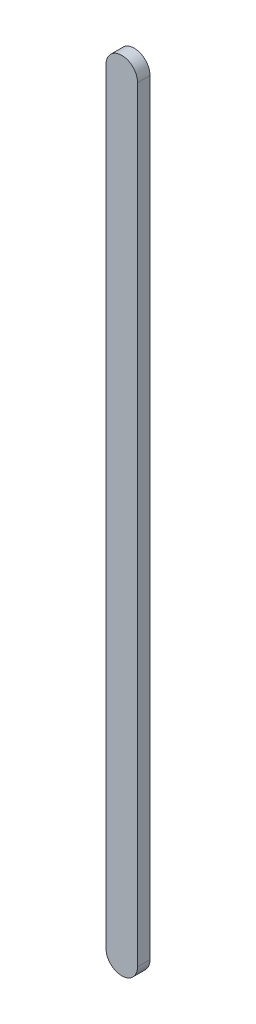
ISO-10303-21;
HEADER;
FILE_DESCRIPTION(('STEP AP214'),'2;1');
FILE_NAME('part.step','',(''),(''),'','','');
FILE_SCHEMA(('AUTOMOTIVE_DESIGN { 1 0 10303 214 1 1 1 1 }'));
ENDSEC;
DATA;
#1=APPLICATION_CONTEXT('core data for automotive mechanical design processes');
#2=APPLICATION_PROTOCOL_DEFINITION('international standard','automotive_design',2000,#1);
#3=PRODUCT_CONTEXT('',#1,'mechanical');
#4=PRODUCT('Part','Part','',(#3));
#5=PRODUCT_RELATED_PRODUCT_CATEGORY('part','',(#4));
#6=PRODUCT_DEFINITION_FORMATION('','',#4);
#7=PRODUCT_DEFINITION_CONTEXT('part definition',#1,'design');
#8=PRODUCT_DEFINITION('design','',#6,#7);
#9=PRODUCT_DEFINITION_SHAPE('','',#8);
#10=(LENGTH_UNIT() NAMED_UNIT(*) SI_UNIT(.MILLI.,.METRE.));
#11=(NAMED_UNIT(*) PLANE_ANGLE_UNIT() SI_UNIT($,.RADIAN.));
#12=(NAMED_UNIT(*) SI_UNIT($,.STERADIAN.) SOLID_ANGLE_UNIT());
#13=UNCERTAINTY_MEASURE_WITH_UNIT(LENGTH_MEASURE(1.E-05),#10,'distance_accuracy_value','');
#14=(GEOMETRIC_REPRESENTATION_CONTEXT(3) GLOBAL_UNCERTAINTY_ASSIGNED_CONTEXT((#13)) GLOBAL_UNIT_ASSIGNED_CONTEXT((#10,
#11,#12)) REPRESENTATION_CONTEXT('',''));
#15=CARTESIAN_POINT('',(0.,0.,0.));
#16=DIRECTION('',(0.,0.,1.));
#17=DIRECTION('',(1.,0.,0.));
#18=AXIS2_PLACEMENT_3D('',#15,#16,#17);
#19=CARTESIAN_POINT('',(92.7664896,89.7295132,0.));
#20=DIRECTION('',(-1.,0.,0.));
#21=DIRECTION('',(0.,1.,0.));
#22=AXIS2_PLACEMENT_3D('',#19,#20,#21);
#23=PLANE('',#22);
#24=DIRECTION('',(0.,1.,0.));
#25=VECTOR('',#24,1.);
#26=CARTESIAN_POINT('',(92.7664896,89.7295132,0.1999996));
#27=LINE('',#26,#25);
#28=CARTESIAN_POINT('',(92.7664896,89.7295132,0.1999996));
#29=VERTEX_POINT('',#28);
#30=CARTESIAN_POINT('',(92.7664896,102.0515104,0.1999996));
#31=VERTEX_POINT('',#30);
#32=EDGE_CURVE('E11',#29,#31,#27,.T.);
#33=ORIENTED_EDGE('',*,*,#32,.F.);
#34=DIRECTION('',(0.,0.,1.));
#35=VECTOR('',#34,1.);
#36=CARTESIAN_POINT('',(92.7664896,89.7295132,0.));
#37=LINE('',#36,#35);
#38=CARTESIAN_POINT('',(92.7664896,89.7295132,0.));
#39=VERTEX_POINT('',#38);
#40=EDGE_CURVE('E24',#39,#29,#37,.T.);
#41=ORIENTED_EDGE('',*,*,#40,.F.);
#42=DIRECTION('',(0.,1.,0.));
#43=VECTOR('',#42,1.);
#44=CARTESIAN_POINT('',(92.7664896,89.7295132,0.));
#45=LINE('',#44,#43);
#46=CARTESIAN_POINT('',(92.7664896,102.0515104,0.));
#47=VERTEX_POINT('',#46);
#48=EDGE_CURVE('E75',#39,#47,#45,.T.);
#49=ORIENTED_EDGE('',*,*,#48,.T.);
#50=DIRECTION('',(0.,0.,1.));
#51=VECTOR('',#50,1.);
#52=CARTESIAN_POINT('',(92.7664896,102.0515104,0.));
#53=LINE('',#52,#51);
#54=EDGE_CURVE('E37',#47,#31,#53,.T.);
#55=ORIENTED_EDGE('',*,*,#54,.T.);
#56=EDGE_LOOP('',(#33,#41,#49,#55));
#57=FACE_BOUND('',#56,.T.);
#58=ADVANCED_FACE('F17',(#57),#23,.F.);
#59=CARTESIAN_POINT('',(92.5124896,102.0515104,0.));
#60=DIRECTION('',(0.,0.,-1.));
#61=DIRECTION('',(1.,0.,0.));
#62=AXIS2_PLACEMENT_3D('',#59,#60,#61);
#63=CYLINDRICAL_SURFACE('',#62,0.254000000000005);
#64=CARTESIAN_POINT('',(92.5124896,102.0515104,0.1999996));
#65=DIRECTION('',(0.,0.,1.));
#66=DIRECTION('',(1.,0.,0.));
#67=AXIS2_PLACEMENT_3D('',#64,#65,#66);
#68=CIRCLE('',#67,0.254000000000005);
#69=CARTESIAN_POINT('',(92.2584896,102.0515104,0.1999996));
#70=VERTEX_POINT('',#69);
#71=EDGE_CURVE('E83',#31,#70,#68,.T.);
#72=ORIENTED_EDGE('',*,*,#71,.F.);
#73=ORIENTED_EDGE('',*,*,#54,.F.);
#74=CARTESIAN_POINT('',(92.5124896,102.0515104,0.));
#75=DIRECTION('',(0.,0.,1.));
#76=DIRECTION('',(1.,0.,0.));
#77=AXIS2_PLACEMENT_3D('',#74,#75,#76);
#78=CIRCLE('',#77,0.254000000000005);
#79=CARTESIAN_POINT('',(92.2584896,102.0515104,0.));
#80=VERTEX_POINT('',#79);
#81=EDGE_CURVE('E81',#47,#80,#78,.T.);
#82=ORIENTED_EDGE('',*,*,#81,.T.);
#83=DIRECTION('',(0.,0.,1.));
#84=VECTOR('',#83,1.);
#85=CARTESIAN_POINT('',(92.2584896,102.0515104,0.));
#86=LINE('',#85,#84);
#87=EDGE_CURVE('E67',#80,#70,#86,.T.);
#88=ORIENTED_EDGE('',*,*,#87,.T.);
#89=EDGE_LOOP('',(#72,#73,#82,#88));
#90=FACE_BOUND('',#89,.T.);
#91=ADVANCED_FACE('F89',(#90),#63,.T.);
#92=CARTESIAN_POINT('',(92.2584896,102.0515104,0.));
#93=DIRECTION('',(1.,0.,0.));
#94=DIRECTION('',(0.,-1.,0.));
#95=AXIS2_PLACEMENT_3D('',#92,#93,#94);
#96=PLANE('',#95);
#97=DIRECTION('',(0.,-1.,0.));
#98=VECTOR('',#97,1.);
#99=CARTESIAN_POINT('',(92.2584896,102.0515104,0.1999996));
#100=LINE('',#99,#98);
#101=CARTESIAN_POINT('',(92.2584896,89.7295132,0.1999996));
#102=VERTEX_POINT('',#101);
#103=EDGE_CURVE('E71',#70,#102,#100,.T.);
#104=ORIENTED_EDGE('',*,*,#103,.F.);
#105=ORIENTED_EDGE('',*,*,#87,.F.);
#106=DIRECTION('',(0.,-1.,0.));
#107=VECTOR('',#106,1.);
#108=CARTESIAN_POINT('',(92.2584896,102.0515104,0.));
#109=LINE('',#108,#107);
#110=CARTESIAN_POINT('',(92.2584896,89.7295132,0.));
#111=VERTEX_POINT('',#110);
#112=EDGE_CURVE('E63',#80,#111,#109,.T.);
#113=ORIENTED_EDGE('',*,*,#112,.T.);
#114=DIRECTION('',(0.,0.,1.));
#115=VECTOR('',#114,1.);
#116=CARTESIAN_POINT('',(92.2584896,89.7295132,0.));
#117=LINE('',#116,#115);
#118=EDGE_CURVE('E53',#111,#102,#117,.T.);
#119=ORIENTED_EDGE('',*,*,#118,.T.);
#120=EDGE_LOOP('',(#104,#105,#113,#119));
#121=FACE_BOUND('',#120,.T.);
#122=ADVANCED_FACE('F66',(#121),#96,.F.);
#123=CARTESIAN_POINT('',(92.5124896,89.7295132,0.));
#124=DIRECTION('',(0.,0.,-1.));
#125=DIRECTION('',(-1.,0.,0.));
#126=AXIS2_PLACEMENT_3D('',#123,#124,#125);
#127=CYLINDRICAL_SURFACE('',#126,0.254000000000005);
#128=CARTESIAN_POINT('',(92.5124896,89.7295132,0.1999996));
#129=DIRECTION('',(0.,0.,1.));
#130=DIRECTION('',(-1.,0.,0.));
#131=AXIS2_PLACEMENT_3D('',#128,#129,#130);
#132=CIRCLE('',#131,0.254000000000005);
#133=EDGE_CURVE('E59',#102,#29,#132,.T.);
#134=ORIENTED_EDGE('',*,*,#133,.F.);
#135=ORIENTED_EDGE('',*,*,#118,.F.);
#136=CARTESIAN_POINT('',(92.5124896,89.7295132,0.));
#137=DIRECTION('',(0.,0.,1.));
#138=DIRECTION('',(-1.,0.,0.));
#139=AXIS2_PLACEMENT_3D('',#136,#137,#138);
#140=CIRCLE('',#139,0.254000000000005);
#141=EDGE_CURVE('E57',#111,#39,#140,.T.);
#142=ORIENTED_EDGE('',*,*,#141,.T.);
#143=ORIENTED_EDGE('',*,*,#40,.T.);
#144=EDGE_LOOP('',(#134,#135,#142,#143));
#145=FACE_BOUND('',#144,.T.);
#146=ADVANCED_FACE('F55',(#145),#127,.T.);
#147=CARTESIAN_POINT('',(92.7664896,89.7295132,0.));
#148=DIRECTION('',(0.,0.,-1.));
#149=DIRECTION('',(-1.,0.,0.));
#150=AXIS2_PLACEMENT_3D('',#147,#148,#149);
#151=PLANE('',#150);
#152=ORIENTED_EDGE('',*,*,#141,.F.);
#153=ORIENTED_EDGE('',*,*,#112,.F.);
#154=ORIENTED_EDGE('',*,*,#81,.F.);
#155=ORIENTED_EDGE('',*,*,#48,.F.);
#156=EDGE_LOOP('',(#152,#153,#154,#155));
#157=FACE_BOUND('',#156,.T.);
#158=ADVANCED_FACE('F74',(#157),#151,.T.);
#159=CARTESIAN_POINT('',(92.7664896,89.7295132,0.1999996));
#160=DIRECTION('',(0.,0.,-1.));
#161=DIRECTION('',(-1.,0.,0.));
#162=AXIS2_PLACEMENT_3D('',#159,#160,#161);
#163=PLANE('',#162);
#164=ORIENTED_EDGE('',*,*,#32,.T.);
#165=ORIENTED_EDGE('',*,*,#71,.T.);
#166=ORIENTED_EDGE('',*,*,#103,.T.);
#167=ORIENTED_EDGE('',*,*,#133,.T.);
#168=EDGE_LOOP('',(#164,#165,#166,#167));
#169=FACE_BOUND('',#168,.T.);
#170=ADVANCED_FACE('F91',(#169),#163,.F.);
#171=CLOSED_SHELL('',(#58,#91,#122,#146,#158,#170));
#172=MANIFOLD_SOLID_BREP('B1',#171);
#173=ADVANCED_BREP_SHAPE_REPRESENTATION('',(#18,#172),#14);
#174=SHAPE_DEFINITION_REPRESENTATION(#9,#173);
ENDSEC;
END-ISO-10303-21;
